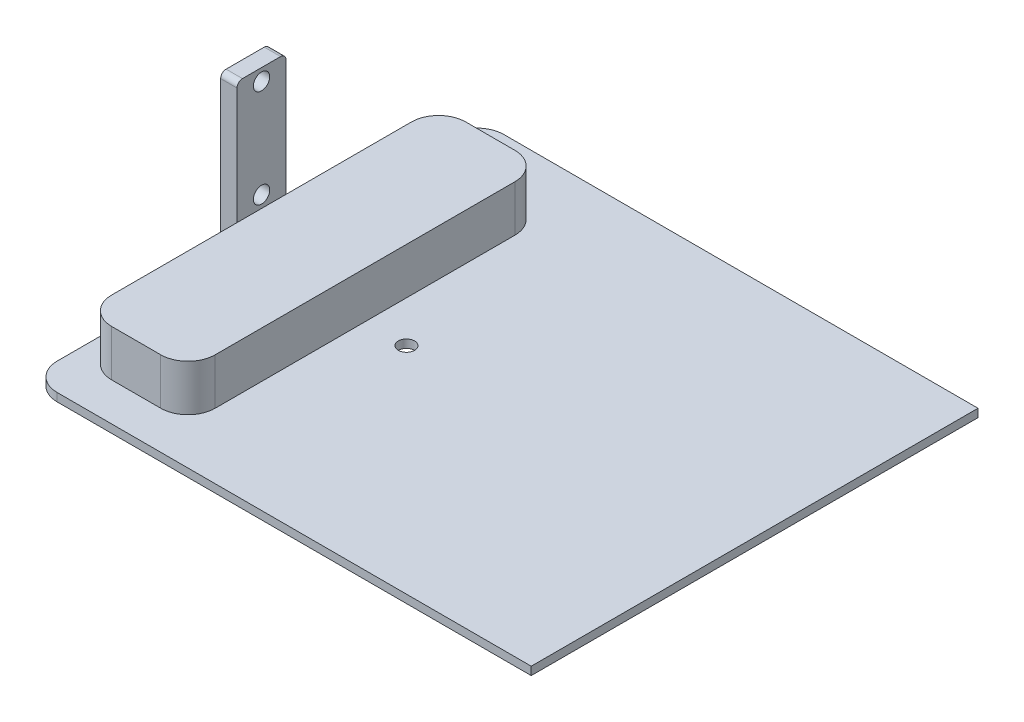
ISO-10303-21;
HEADER;
FILE_DESCRIPTION(('STEP AP214'),'2;1');
FILE_NAME('part.step','',(''),(''),'','','');
FILE_SCHEMA(('AUTOMOTIVE_DESIGN { 1 0 10303 214 1 1 1 1 }'));
ENDSEC;
DATA;
#1=APPLICATION_CONTEXT('core data for automotive mechanical design processes');
#2=APPLICATION_PROTOCOL_DEFINITION('international standard','automotive_design',2000,#1);
#3=PRODUCT_CONTEXT('',#1,'mechanical');
#4=PRODUCT('Part','Part','',(#3));
#5=PRODUCT_RELATED_PRODUCT_CATEGORY('part','',(#4));
#6=PRODUCT_DEFINITION_FORMATION('','',#4);
#7=PRODUCT_DEFINITION_CONTEXT('part definition',#1,'design');
#8=PRODUCT_DEFINITION('design','',#6,#7);
#9=PRODUCT_DEFINITION_SHAPE('','',#8);
#10=(LENGTH_UNIT() NAMED_UNIT(*) SI_UNIT(.MILLI.,.METRE.));
#11=(NAMED_UNIT(*) PLANE_ANGLE_UNIT() SI_UNIT($,.RADIAN.));
#12=(NAMED_UNIT(*) SI_UNIT($,.STERADIAN.) SOLID_ANGLE_UNIT());
#13=UNCERTAINTY_MEASURE_WITH_UNIT(LENGTH_MEASURE(1.E-05),#10,'distance_accuracy_value','');
#14=(GEOMETRIC_REPRESENTATION_CONTEXT(3) GLOBAL_UNCERTAINTY_ASSIGNED_CONTEXT((#13)) GLOBAL_UNIT_ASSIGNED_CONTEXT((#10,
#11,#12)) REPRESENTATION_CONTEXT('',''));
#15=CARTESIAN_POINT('',(0.,0.,0.));
#16=DIRECTION('',(0.,0.,1.));
#17=DIRECTION('',(1.,0.,0.));
#18=AXIS2_PLACEMENT_3D('',#15,#16,#17);
#19=CARTESIAN_POINT('',(0.,1.5,0.));
#20=DIRECTION('',(0.,1.,0.));
#21=DIRECTION('',(0.,0.,1.));
#22=AXIS2_PLACEMENT_3D('',#19,#20,#21);
#23=PLANE('',#22);
#24=CARTESIAN_POINT('',(-16.4,1.5,1.49999999999999));
#25=DIRECTION('',(0.,1.,0.));
#26=DIRECTION('',(0.,0.,1.));
#27=AXIS2_PLACEMENT_3D('',#24,#25,#26);
#28=CIRCLE('',#27,1.5);
#29=CARTESIAN_POINT('',(-16.4,1.5,2.99999999999999));
#30=VERTEX_POINT('',#29);
#31=EDGE_CURVE('E522',#30,#30,#28,.T.);
#32=ORIENTED_EDGE('',*,*,#31,.F.);
#33=EDGE_LOOP('',(#32));
#34=FACE_BOUND('',#33,.T.);
#35=DIRECTION('',(0.,0.,1.));
#36=VECTOR('',#35,1.);
#37=CARTESIAN_POINT('',(-46.,1.5,-41.));
#38=LINE('',#37,#36);
#39=CARTESIAN_POINT('',(-46.,1.5,-36.));
#40=VERTEX_POINT('',#39);
#41=CARTESIAN_POINT('',(-46.,1.5,-8.00000000000001));
#42=VERTEX_POINT('',#41);
#43=EDGE_CURVE('E290',#40,#42,#38,.T.);
#44=ORIENTED_EDGE('',*,*,#43,.T.);
#45=DIRECTION('',(-1.,0.,0.));
#46=VECTOR('',#45,1.);
#47=CARTESIAN_POINT('',(0.,1.5,-8.00000000000005));
#48=LINE('',#47,#46);
#49=CARTESIAN_POINT('',(-43.,1.5,-8.00000000000001));
#50=VERTEX_POINT('',#49);
#51=EDGE_CURVE('E330',#42,#50,#48,.F.);
#52=ORIENTED_EDGE('',*,*,#51,.T.);
#53=DIRECTION('',(0.,0.,1.));
#54=VECTOR('',#53,1.);
#55=CARTESIAN_POINT('',(-43.,1.5,-31.));
#56=LINE('',#55,#54);
#57=CARTESIAN_POINT('',(-43.,1.5,-26.));
#58=VERTEX_POINT('',#57);
#59=EDGE_CURVE('E265',#58,#50,#56,.T.);
#60=ORIENTED_EDGE('',*,*,#59,.F.);
#61=CARTESIAN_POINT('',(-38.,1.5,-26.));
#62=DIRECTION('',(0.,1.,0.));
#63=DIRECTION('',(0.,0.,1.));
#64=AXIS2_PLACEMENT_3D('',#61,#62,#63);
#65=CIRCLE('',#64,5.);
#66=CARTESIAN_POINT('',(-38.,1.5,-31.));
#67=VERTEX_POINT('',#66);
#68=EDGE_CURVE('E416',#58,#67,#65,.F.);
#69=ORIENTED_EDGE('',*,*,#68,.T.);
#70=DIRECTION('',(-1.,0.,0.));
#71=VECTOR('',#70,1.);
#72=CARTESIAN_POINT('',(-43.,1.5,-31.));
#73=LINE('',#72,#71);
#74=CARTESIAN_POINT('',(-29.,1.5,-31.));
#75=VERTEX_POINT('',#74);
#76=EDGE_CURVE('E276',#75,#67,#73,.T.);
#77=ORIENTED_EDGE('',*,*,#76,.F.);
#78=CARTESIAN_POINT('',(-29.,1.5,-26.));
#79=DIRECTION('',(0.,1.,0.));
#80=DIRECTION('',(0.,0.,1.));
#81=AXIS2_PLACEMENT_3D('',#78,#79,#80);
#82=CIRCLE('',#81,5.);
#83=CARTESIAN_POINT('',(-24.,1.5,-26.));
#84=VERTEX_POINT('',#83);
#85=EDGE_CURVE('E413',#75,#84,#82,.F.);
#86=ORIENTED_EDGE('',*,*,#85,.T.);
#87=DIRECTION('',(0.,0.,-1.));
#88=VECTOR('',#87,1.);
#89=CARTESIAN_POINT('',(-24.,1.5,-31.));
#90=LINE('',#89,#88);
#91=CARTESIAN_POINT('',(-24.,1.5,29.));
#92=VERTEX_POINT('',#91);
#93=EDGE_CURVE('E272',#92,#84,#90,.T.);
#94=ORIENTED_EDGE('',*,*,#93,.F.);
#95=CARTESIAN_POINT('',(-29.,1.5,29.));
#96=DIRECTION('',(0.,1.,0.));
#97=DIRECTION('',(0.,0.,1.));
#98=AXIS2_PLACEMENT_3D('',#95,#96,#97);
#99=CIRCLE('',#98,5.);
#100=CARTESIAN_POINT('',(-29.,1.5,34.));
#101=VERTEX_POINT('',#100);
#102=EDGE_CURVE('E407',#92,#101,#99,.F.);
#103=ORIENTED_EDGE('',*,*,#102,.T.);
#104=DIRECTION('',(1.,0.,0.));
#105=VECTOR('',#104,1.);
#106=CARTESIAN_POINT('',(-43.,1.5,34.));
#107=LINE('',#106,#105);
#108=CARTESIAN_POINT('',(-38.,1.5,34.));
#109=VERTEX_POINT('',#108);
#110=EDGE_CURVE('E268',#109,#101,#107,.T.);
#111=ORIENTED_EDGE('',*,*,#110,.F.);
#112=CARTESIAN_POINT('',(-38.,1.5,29.));
#113=DIRECTION('',(0.,1.,0.));
#114=DIRECTION('',(0.,0.,1.));
#115=AXIS2_PLACEMENT_3D('',#112,#113,#114);
#116=CIRCLE('',#115,5.);
#117=CARTESIAN_POINT('',(-43.,1.5,29.));
#118=VERTEX_POINT('',#117);
#119=EDGE_CURVE('E410',#109,#118,#116,.F.);
#120=ORIENTED_EDGE('',*,*,#119,.T.);
#121=CARTESIAN_POINT('',(-43.,1.5,11.));
#122=VERTEX_POINT('',#121);
#123=EDGE_CURVE('E253',#122,#118,#56,.T.);
#124=ORIENTED_EDGE('',*,*,#123,.F.);
#125=DIRECTION('',(1.,0.,0.));
#126=VECTOR('',#125,1.);
#127=CARTESIAN_POINT('',(0.,1.5,11.));
#128=LINE('',#127,#126);
#129=CARTESIAN_POINT('',(-46.,1.5,11.));
#130=VERTEX_POINT('',#129);
#131=EDGE_CURVE('E327',#122,#130,#128,.F.);
#132=ORIENTED_EDGE('',*,*,#131,.T.);
#133=CARTESIAN_POINT('',(-46.,1.5,36.));
#134=VERTEX_POINT('',#133);
#135=EDGE_CURVE('E289',#130,#134,#38,.T.);
#136=ORIENTED_EDGE('',*,*,#135,.T.);
#137=CARTESIAN_POINT('',(-41.,1.5,36.));
#138=DIRECTION('',(0.,1.,0.));
#139=DIRECTION('',(0.,0.,1.));
#140=AXIS2_PLACEMENT_3D('',#137,#138,#139);
#141=CIRCLE('',#140,5.);
#142=CARTESIAN_POINT('',(-41.,1.5,41.));
#143=VERTEX_POINT('',#142);
#144=EDGE_CURVE('E321',#134,#143,#141,.T.);
#145=ORIENTED_EDGE('',*,*,#144,.T.);
#146=DIRECTION('',(1.,0.,0.));
#147=VECTOR('',#146,1.);
#148=CARTESIAN_POINT('',(-46.,1.5,41.));
#149=LINE('',#148,#147);
#150=CARTESIAN_POINT('',(46.,1.5,41.));
#151=VERTEX_POINT('',#150);
#152=EDGE_CURVE('E294',#143,#151,#149,.T.);
#153=ORIENTED_EDGE('',*,*,#152,.T.);
#154=DIRECTION('',(0.,0.,-1.));
#155=VECTOR('',#154,1.);
#156=CARTESIAN_POINT('',(46.,1.5,-41.));
#157=LINE('',#156,#155);
#158=CARTESIAN_POINT('',(46.,1.5,-41.));
#159=VERTEX_POINT('',#158);
#160=EDGE_CURVE('E280',#151,#159,#157,.T.);
#161=ORIENTED_EDGE('',*,*,#160,.T.);
#162=DIRECTION('',(-1.,0.,0.));
#163=VECTOR('',#162,1.);
#164=CARTESIAN_POINT('',(-46.,1.5,-41.));
#165=LINE('',#164,#163);
#166=CARTESIAN_POINT('',(-41.,1.5,-41.));
#167=VERTEX_POINT('',#166);
#168=EDGE_CURVE('E284',#159,#167,#165,.T.);
#169=ORIENTED_EDGE('',*,*,#168,.T.);
#170=CARTESIAN_POINT('',(-41.,1.5,-36.));
#171=DIRECTION('',(0.,1.,0.));
#172=DIRECTION('',(0.,0.,1.));
#173=AXIS2_PLACEMENT_3D('',#170,#171,#172);
#174=CIRCLE('',#173,5.);
#175=EDGE_CURVE('E324',#167,#40,#174,.T.);
#176=ORIENTED_EDGE('',*,*,#175,.T.);
#177=EDGE_LOOP('',(#44,#52,#60,#69,#77,#86,#94,#103,#111,#120,#124,#132,#136,#145,#153,#161,
#169,#176));
#178=FACE_BOUND('',#177,.T.);
#179=ADVANCED_FACE('F45',(#34,#178),#23,.T.);
#180=CARTESIAN_POINT('',(-43.,10.,-31.));
#181=DIRECTION('',(1.,0.,0.));
#182=DIRECTION('',(0.,0.,-1.));
#183=AXIS2_PLACEMENT_3D('',#180,#181,#182);
#184=PLANE('',#183);
#185=DIRECTION('',(0.,-1.,0.));
#186=VECTOR('',#185,1.);
#187=CARTESIAN_POINT('',(-43.,32.4,5.99999999999999));
#188=LINE('',#187,#186);
#189=CARTESIAN_POINT('',(-43.,10.,5.99999999999998));
#190=VERTEX_POINT('',#189);
#191=CARTESIAN_POINT('',(-43.,6.5,5.99999999999999));
#192=VERTEX_POINT('',#191);
#193=EDGE_CURVE('E213',#190,#192,#188,.T.);
#194=ORIENTED_EDGE('',*,*,#193,.T.);
#195=CARTESIAN_POINT('',(-43.,6.5,11.));
#196=DIRECTION('',(1.,0.,0.));
#197=DIRECTION('',(0.,0.,-1.));
#198=AXIS2_PLACEMENT_3D('',#195,#196,#197);
#199=CIRCLE('',#198,5.);
#200=EDGE_CURVE('E345',#192,#122,#199,.F.);
#201=ORIENTED_EDGE('',*,*,#200,.T.);
#202=ORIENTED_EDGE('',*,*,#123,.T.);
#203=DIRECTION('',(0.,-1.,0.));
#204=VECTOR('',#203,1.);
#205=CARTESIAN_POINT('',(-43.,10.,29.));
#206=LINE('',#205,#204);
#207=CARTESIAN_POINT('',(-43.,10.,29.));
#208=VERTEX_POINT('',#207);
#209=EDGE_CURVE('E342',#118,#208,#206,.F.);
#210=ORIENTED_EDGE('',*,*,#209,.T.);
#211=DIRECTION('',(0.,0.,1.));
#212=VECTOR('',#211,1.);
#213=CARTESIAN_POINT('',(-43.,10.,-31.));
#214=LINE('',#213,#212);
#215=EDGE_CURVE('E232',#190,#208,#214,.T.);
#216=ORIENTED_EDGE('',*,*,#215,.F.);
#217=EDGE_LOOP('',(#194,#201,#202,#210,#216));
#218=FACE_BOUND('',#217,.T.);
#219=ADVANCED_FACE('F457',(#218),#184,.F.);
#220=ORIENTED_EDGE('',*,*,#59,.T.);
#221=CARTESIAN_POINT('',(-43.,6.5,-8.00000000000001));
#222=DIRECTION('',(1.,0.,0.));
#223=DIRECTION('',(0.,0.,-1.));
#224=AXIS2_PLACEMENT_3D('',#221,#222,#223);
#225=CIRCLE('',#224,5.);
#226=CARTESIAN_POINT('',(-43.,6.5,-3.00000000000001));
#227=VERTEX_POINT('',#226);
#228=EDGE_CURVE('E241',#50,#227,#225,.F.);
#229=ORIENTED_EDGE('',*,*,#228,.T.);
#230=DIRECTION('',(0.,-1.,0.));
#231=VECTOR('',#230,1.);
#232=CARTESIAN_POINT('',(-43.,32.4,-3.00000000000001));
#233=LINE('',#232,#231);
#234=CARTESIAN_POINT('',(-43.,10.,-3.00000000000001));
#235=VERTEX_POINT('',#234);
#236=EDGE_CURVE('E206',#235,#227,#233,.T.);
#237=ORIENTED_EDGE('',*,*,#236,.F.);
#238=CARTESIAN_POINT('',(-43.,10.,-26.));
#239=VERTEX_POINT('',#238);
#240=EDGE_CURVE('E218',#239,#235,#214,.T.);
#241=ORIENTED_EDGE('',*,*,#240,.F.);
#242=DIRECTION('',(0.,-1.,0.));
#243=VECTOR('',#242,1.);
#244=CARTESIAN_POINT('',(-43.,10.,-26.));
#245=LINE('',#244,#243);
#246=EDGE_CURVE('E333',#239,#58,#245,.T.);
#247=ORIENTED_EDGE('',*,*,#246,.T.);
#248=EDGE_LOOP('',(#220,#229,#237,#241,#247));
#249=FACE_BOUND('',#248,.T.);
#250=ADVANCED_FACE('F239',(#249),#184,.F.);
#251=CARTESIAN_POINT('',(46.,1.5,-41.));
#252=DIRECTION('',(-1.,0.,0.));
#253=DIRECTION('',(0.,0.,1.));
#254=AXIS2_PLACEMENT_3D('',#251,#252,#253);
#255=PLANE('',#254);
#256=DIRECTION('',(0.,0.,-1.));
#257=VECTOR('',#256,1.);
#258=CARTESIAN_POINT('',(46.,0.,-41.));
#259=LINE('',#258,#257);
#260=CARTESIAN_POINT('',(46.,0.,41.));
#261=VERTEX_POINT('',#260);
#262=CARTESIAN_POINT('',(46.,0.,-41.));
#263=VERTEX_POINT('',#262);
#264=EDGE_CURVE('E264',#261,#263,#259,.T.);
#265=ORIENTED_EDGE('',*,*,#264,.T.);
#266=DIRECTION('',(0.,-1.,0.));
#267=VECTOR('',#266,1.);
#268=CARTESIAN_POINT('',(46.,1.5,-41.));
#269=LINE('',#268,#267);
#270=EDGE_CURVE('E314',#159,#263,#269,.T.);
#271=ORIENTED_EDGE('',*,*,#270,.F.);
#272=ORIENTED_EDGE('',*,*,#160,.F.);
#273=DIRECTION('',(0.,-1.,0.));
#274=VECTOR('',#273,1.);
#275=CARTESIAN_POINT('',(46.,1.5,41.));
#276=LINE('',#275,#274);
#277=EDGE_CURVE('E297',#151,#261,#276,.T.);
#278=ORIENTED_EDGE('',*,*,#277,.T.);
#279=EDGE_LOOP('',(#265,#271,#272,#278));
#280=FACE_BOUND('',#279,.T.);
#281=ADVANCED_FACE('F552',(#280),#255,.F.);
#282=CARTESIAN_POINT('',(-46.,1.5,-41.));
#283=DIRECTION('',(0.,0.,1.));
#284=DIRECTION('',(1.,0.,0.));
#285=AXIS2_PLACEMENT_3D('',#282,#283,#284);
#286=PLANE('',#285);
#287=DIRECTION('',(-1.,0.,0.));
#288=VECTOR('',#287,1.);
#289=CARTESIAN_POINT('',(-46.,0.,-41.));
#290=LINE('',#289,#288);
#291=CARTESIAN_POINT('',(-41.,0.,-41.));
#292=VERTEX_POINT('',#291);
#293=EDGE_CURVE('E301',#263,#292,#290,.T.);
#294=ORIENTED_EDGE('',*,*,#293,.T.);
#295=DIRECTION('',(0.,-1.,0.));
#296=VECTOR('',#295,1.);
#297=CARTESIAN_POINT('',(-41.,1.5,-41.));
#298=LINE('',#297,#296);
#299=EDGE_CURVE('E393',#292,#167,#298,.F.);
#300=ORIENTED_EDGE('',*,*,#299,.T.);
#301=ORIENTED_EDGE('',*,*,#168,.F.);
#302=ORIENTED_EDGE('',*,*,#270,.T.);
#303=EDGE_LOOP('',(#294,#300,#301,#302));
#304=FACE_BOUND('',#303,.T.);
#305=ADVANCED_FACE('F548',(#304),#286,.F.);
#306=CARTESIAN_POINT('',(-46.,1.5,-41.));
#307=DIRECTION('',(1.,0.,0.));
#308=DIRECTION('',(0.,0.,-1.));
#309=AXIS2_PLACEMENT_3D('',#306,#307,#308);
#310=PLANE('',#309);
#311=CARTESIAN_POINT('',(-46.,30.2,1.49999999999999));
#312=DIRECTION('',(1.,0.,0.));
#313=DIRECTION('',(0.,0.,-1.));
#314=AXIS2_PLACEMENT_3D('',#311,#312,#313);
#315=CIRCLE('',#314,1.5);
#316=CARTESIAN_POINT('',(-46.,30.2,0.));
#317=VERTEX_POINT('',#316);
#318=EDGE_CURVE('E507',#317,#317,#315,.T.);
#319=ORIENTED_EDGE('',*,*,#318,.T.);
#320=EDGE_LOOP('',(#319));
#321=FACE_BOUND('',#320,.T.);
#322=CARTESIAN_POINT('',(-46.,12.2,1.49999999999999));
#323=DIRECTION('',(1.,0.,0.));
#324=DIRECTION('',(0.,0.,1.));
#325=AXIS2_PLACEMENT_3D('',#322,#323,#324);
#326=CIRCLE('',#325,1.5);
#327=CARTESIAN_POINT('',(-46.,12.2,2.99999999999999));
#328=VERTEX_POINT('',#327);
#329=EDGE_CURVE('E503',#328,#328,#326,.T.);
#330=ORIENTED_EDGE('',*,*,#329,.T.);
#331=EDGE_LOOP('',(#330));
#332=FACE_BOUND('',#331,.T.);
#333=DIRECTION('',(0.,-1.,0.));
#334=VECTOR('',#333,1.);
#335=CARTESIAN_POINT('',(-46.,32.4,5.99999999999998));
#336=LINE('',#335,#334);
#337=CARTESIAN_POINT('',(-46.,31.4,5.99999999999998));
#338=VERTEX_POINT('',#337);
#339=CARTESIAN_POINT('',(-46.,6.5,5.99999999999998));
#340=VERTEX_POINT('',#339);
#341=EDGE_CURVE('E251',#338,#340,#336,.T.);
#342=ORIENTED_EDGE('',*,*,#341,.F.);
#343=CARTESIAN_POINT('',(-46.,31.4,4.99999999999998));
#344=DIRECTION('',(1.,0.,0.));
#345=DIRECTION('',(0.,0.,-1.));
#346=AXIS2_PLACEMENT_3D('',#343,#344,#345);
#347=CIRCLE('',#346,1.);
#348=CARTESIAN_POINT('',(-46.,32.4,4.99999999999998));
#349=VERTEX_POINT('',#348);
#350=EDGE_CURVE('E54',#338,#349,#347,.F.);
#351=ORIENTED_EDGE('',*,*,#350,.T.);
#352=DIRECTION('',(0.,0.,1.));
#353=VECTOR('',#352,1.);
#354=CARTESIAN_POINT('',(-46.,32.4,5.99999999999998));
#355=LINE('',#354,#353);
#356=CARTESIAN_POINT('',(-46.,32.4,-2.00000000000001));
#357=VERTEX_POINT('',#356);
#358=EDGE_CURVE('E440',#357,#349,#355,.T.);
#359=ORIENTED_EDGE('',*,*,#358,.F.);
#360=CARTESIAN_POINT('',(-46.,31.4,-2.00000000000001));
#361=DIRECTION('',(1.,0.,0.));
#362=DIRECTION('',(0.,0.,-1.));
#363=AXIS2_PLACEMENT_3D('',#360,#361,#362);
#364=CIRCLE('',#363,1.);
#365=CARTESIAN_POINT('',(-46.,31.4,-3.00000000000001));
#366=VERTEX_POINT('',#365);
#367=EDGE_CURVE('E61',#357,#366,#364,.F.);
#368=ORIENTED_EDGE('',*,*,#367,.T.);
#369=DIRECTION('',(0.,-1.,0.));
#370=VECTOR('',#369,1.);
#371=CARTESIAN_POINT('',(-46.,32.4,-3.00000000000001));
#372=LINE('',#371,#370);
#373=CARTESIAN_POINT('',(-46.,6.5,-3.00000000000001));
#374=VERTEX_POINT('',#373);
#375=EDGE_CURVE('E243',#366,#374,#372,.T.);
#376=ORIENTED_EDGE('',*,*,#375,.T.);
#377=CARTESIAN_POINT('',(-46.,6.5,-8.00000000000001));
#378=DIRECTION('',(1.,0.,0.));
#379=DIRECTION('',(0.,0.,-1.));
#380=AXIS2_PLACEMENT_3D('',#377,#378,#379);
#381=CIRCLE('',#380,5.);
#382=EDGE_CURVE('E400',#374,#42,#381,.T.);
#383=ORIENTED_EDGE('',*,*,#382,.T.);
#384=ORIENTED_EDGE('',*,*,#43,.F.);
#385=DIRECTION('',(0.,-1.,0.));
#386=VECTOR('',#385,1.);
#387=CARTESIAN_POINT('',(-46.,1.5,-36.));
#388=LINE('',#387,#386);
#389=CARTESIAN_POINT('',(-46.,0.,-36.));
#390=VERTEX_POINT('',#389);
#391=EDGE_CURVE('E383',#40,#390,#388,.T.);
#392=ORIENTED_EDGE('',*,*,#391,.T.);
#393=DIRECTION('',(0.,0.,1.));
#394=VECTOR('',#393,1.);
#395=CARTESIAN_POINT('',(-46.,0.,-41.));
#396=LINE('',#395,#394);
#397=CARTESIAN_POINT('',(-46.,0.,36.));
#398=VERTEX_POINT('',#397);
#399=EDGE_CURVE('E305',#390,#398,#396,.T.);
#400=ORIENTED_EDGE('',*,*,#399,.T.);
#401=DIRECTION('',(0.,-1.,0.));
#402=VECTOR('',#401,1.);
#403=CARTESIAN_POINT('',(-46.,1.5,36.));
#404=LINE('',#403,#402);
#405=EDGE_CURVE('E380',#398,#134,#404,.F.);
#406=ORIENTED_EDGE('',*,*,#405,.T.);
#407=ORIENTED_EDGE('',*,*,#135,.F.);
#408=CARTESIAN_POINT('',(-46.,6.5,11.));
#409=DIRECTION('',(1.,0.,0.));
#410=DIRECTION('',(0.,0.,-1.));
#411=AXIS2_PLACEMENT_3D('',#408,#409,#410);
#412=CIRCLE('',#411,5.);
#413=EDGE_CURVE('E403',#130,#340,#412,.T.);
#414=ORIENTED_EDGE('',*,*,#413,.T.);
#415=EDGE_LOOP('',(#342,#351,#359,#368,#376,#383,#384,#392,#400,#406,#407,#414));
#416=FACE_BOUND('',#415,.T.);
#417=ADVANCED_FACE('F439',(#321,#332,#416),#310,.F.);
#418=CARTESIAN_POINT('',(-46.,1.5,41.));
#419=DIRECTION('',(0.,0.,-1.));
#420=DIRECTION('',(-1.,0.,0.));
#421=AXIS2_PLACEMENT_3D('',#418,#419,#420);
#422=PLANE('',#421);
#423=ORIENTED_EDGE('',*,*,#152,.F.);
#424=DIRECTION('',(0.,-1.,0.));
#425=VECTOR('',#424,1.);
#426=CARTESIAN_POINT('',(-41.,1.5,41.));
#427=LINE('',#426,#425);
#428=CARTESIAN_POINT('',(-41.,0.,41.));
#429=VERTEX_POINT('',#428);
#430=EDGE_CURVE('E396',#143,#429,#427,.T.);
#431=ORIENTED_EDGE('',*,*,#430,.T.);
#432=DIRECTION('',(1.,0.,0.));
#433=VECTOR('',#432,1.);
#434=CARTESIAN_POINT('',(-46.,0.,41.));
#435=LINE('',#434,#433);
#436=EDGE_CURVE('E285',#429,#261,#435,.T.);
#437=ORIENTED_EDGE('',*,*,#436,.T.);
#438=ORIENTED_EDGE('',*,*,#277,.F.);
#439=EDGE_LOOP('',(#423,#431,#437,#438));
#440=FACE_BOUND('',#439,.T.);
#441=ADVANCED_FACE('F541',(#440),#422,.F.);
#442=CARTESIAN_POINT('',(0.,0.,0.));
#443=DIRECTION('',(0.,1.,0.));
#444=DIRECTION('',(0.,0.,1.));
#445=AXIS2_PLACEMENT_3D('',#442,#443,#444);
#446=PLANE('',#445);
#447=CARTESIAN_POINT('',(-16.4,0.,1.49999999999999));
#448=DIRECTION('',(0.,1.,0.));
#449=DIRECTION('',(0.,0.,1.));
#450=AXIS2_PLACEMENT_3D('',#447,#448,#449);
#451=CIRCLE('',#450,1.5);
#452=CARTESIAN_POINT('',(-16.4,0.,2.99999999999999));
#453=VERTEX_POINT('',#452);
#454=EDGE_CURVE('E512',#453,#453,#451,.F.);
#455=ORIENTED_EDGE('',*,*,#454,.F.);
#456=EDGE_LOOP('',(#455));
#457=FACE_BOUND('',#456,.T.);
#458=ORIENTED_EDGE('',*,*,#399,.F.);
#459=CARTESIAN_POINT('',(-41.,0.,-36.));
#460=DIRECTION('',(0.,1.,0.));
#461=DIRECTION('',(0.,0.,1.));
#462=AXIS2_PLACEMENT_3D('',#459,#460,#461);
#463=CIRCLE('',#462,5.);
#464=EDGE_CURVE('E390',#390,#292,#463,.F.);
#465=ORIENTED_EDGE('',*,*,#464,.T.);
#466=ORIENTED_EDGE('',*,*,#293,.F.);
#467=ORIENTED_EDGE('',*,*,#264,.F.);
#468=ORIENTED_EDGE('',*,*,#436,.F.);
#469=CARTESIAN_POINT('',(-41.,0.,36.));
#470=DIRECTION('',(0.,1.,0.));
#471=DIRECTION('',(0.,0.,1.));
#472=AXIS2_PLACEMENT_3D('',#469,#470,#471);
#473=CIRCLE('',#472,5.);
#474=EDGE_CURVE('E387',#429,#398,#473,.F.);
#475=ORIENTED_EDGE('',*,*,#474,.T.);
#476=EDGE_LOOP('',(#458,#465,#466,#467,#468,#475));
#477=FACE_BOUND('',#476,.T.);
#478=ADVANCED_FACE('F538',(#457,#477),#446,.F.);
#479=CARTESIAN_POINT('',(-43.,10.,34.));
#480=DIRECTION('',(0.,0.,-1.));
#481=DIRECTION('',(-1.,0.,0.));
#482=AXIS2_PLACEMENT_3D('',#479,#480,#481);
#483=PLANE('',#482);
#484=ORIENTED_EDGE('',*,*,#110,.T.);
#485=DIRECTION('',(0.,-1.,0.));
#486=VECTOR('',#485,1.);
#487=CARTESIAN_POINT('',(-29.,10.,34.));
#488=LINE('',#487,#486);
#489=CARTESIAN_POINT('',(-29.,10.,34.));
#490=VERTEX_POINT('',#489);
#491=EDGE_CURVE('E359',#101,#490,#488,.F.);
#492=ORIENTED_EDGE('',*,*,#491,.T.);
#493=DIRECTION('',(1.,0.,0.));
#494=VECTOR('',#493,1.);
#495=CARTESIAN_POINT('',(-43.,10.,34.));
#496=LINE('',#495,#494);
#497=CARTESIAN_POINT('',(-38.,10.,34.));
#498=VERTEX_POINT('',#497);
#499=EDGE_CURVE('E230',#498,#490,#496,.T.);
#500=ORIENTED_EDGE('',*,*,#499,.F.);
#501=DIRECTION('',(0.,-1.,0.));
#502=VECTOR('',#501,1.);
#503=CARTESIAN_POINT('',(-38.,10.,34.));
#504=LINE('',#503,#502);
#505=EDGE_CURVE('E355',#498,#109,#504,.T.);
#506=ORIENTED_EDGE('',*,*,#505,.T.);
#507=EDGE_LOOP('',(#484,#492,#500,#506));
#508=FACE_BOUND('',#507,.T.);
#509=ADVANCED_FACE('F472',(#508),#483,.F.);
#510=CARTESIAN_POINT('',(-24.,10.,-31.));
#511=DIRECTION('',(-1.,0.,0.));
#512=DIRECTION('',(0.,0.,1.));
#513=AXIS2_PLACEMENT_3D('',#510,#511,#512);
#514=PLANE('',#513);
#515=DIRECTION('',(0.,0.,-1.));
#516=VECTOR('',#515,1.);
#517=CARTESIAN_POINT('',(-24.,10.,-31.));
#518=LINE('',#517,#516);
#519=CARTESIAN_POINT('',(-24.,10.,29.));
#520=VERTEX_POINT('',#519);
#521=CARTESIAN_POINT('',(-24.,10.,-26.));
#522=VERTEX_POINT('',#521);
#523=EDGE_CURVE('E257',#520,#522,#518,.T.);
#524=ORIENTED_EDGE('',*,*,#523,.F.);
#525=DIRECTION('',(0.,-1.,0.));
#526=VECTOR('',#525,1.);
#527=CARTESIAN_POINT('',(-24.,10.,29.));
#528=LINE('',#527,#526);
#529=EDGE_CURVE('E351',#520,#92,#528,.T.);
#530=ORIENTED_EDGE('',*,*,#529,.T.);
#531=ORIENTED_EDGE('',*,*,#93,.T.);
#532=DIRECTION('',(0.,-1.,0.));
#533=VECTOR('',#532,1.);
#534=CARTESIAN_POINT('',(-24.,10.,-26.));
#535=LINE('',#534,#533);
#536=EDGE_CURVE('E348',#84,#522,#535,.F.);
#537=ORIENTED_EDGE('',*,*,#536,.T.);
#538=EDGE_LOOP('',(#524,#530,#531,#537));
#539=FACE_BOUND('',#538,.T.);
#540=ADVANCED_FACE('F481',(#539),#514,.F.);
#541=CARTESIAN_POINT('',(-43.,10.,-31.));
#542=DIRECTION('',(0.,0.,1.));
#543=DIRECTION('',(1.,0.,0.));
#544=AXIS2_PLACEMENT_3D('',#541,#542,#543);
#545=PLANE('',#544);
#546=DIRECTION('',(-1.,0.,0.));
#547=VECTOR('',#546,1.);
#548=CARTESIAN_POINT('',(-43.,10.,-31.));
#549=LINE('',#548,#547);
#550=CARTESIAN_POINT('',(-29.,10.,-31.));
#551=VERTEX_POINT('',#550);
#552=CARTESIAN_POINT('',(-38.,10.,-31.));
#553=VERTEX_POINT('',#552);
#554=EDGE_CURVE('E261',#551,#553,#549,.T.);
#555=ORIENTED_EDGE('',*,*,#554,.F.);
#556=DIRECTION('',(0.,-1.,0.));
#557=VECTOR('',#556,1.);
#558=CARTESIAN_POINT('',(-29.,10.,-31.));
#559=LINE('',#558,#557);
#560=EDGE_CURVE('E376',#551,#75,#559,.T.);
#561=ORIENTED_EDGE('',*,*,#560,.T.);
#562=ORIENTED_EDGE('',*,*,#76,.T.);
#563=DIRECTION('',(0.,-1.,0.));
#564=VECTOR('',#563,1.);
#565=CARTESIAN_POINT('',(-38.,10.,-31.));
#566=LINE('',#565,#564);
#567=EDGE_CURVE('E373',#67,#553,#566,.F.);
#568=ORIENTED_EDGE('',*,*,#567,.T.);
#569=EDGE_LOOP('',(#555,#561,#562,#568));
#570=FACE_BOUND('',#569,.T.);
#571=ADVANCED_FACE('F489',(#570),#545,.F.);
#572=CARTESIAN_POINT('',(0.,10.,0.));
#573=DIRECTION('',(0.,1.,0.));
#574=DIRECTION('',(0.,0.,1.));
#575=AXIS2_PLACEMENT_3D('',#572,#573,#574);
#576=PLANE('',#575);
#577=ORIENTED_EDGE('',*,*,#499,.T.);
#578=CARTESIAN_POINT('',(-29.,10.,29.));
#579=DIRECTION('',(0.,1.,0.));
#580=DIRECTION('',(0.,0.,1.));
#581=AXIS2_PLACEMENT_3D('',#578,#579,#580);
#582=CIRCLE('',#581,5.);
#583=EDGE_CURVE('E370',#490,#520,#582,.T.);
#584=ORIENTED_EDGE('',*,*,#583,.T.);
#585=ORIENTED_EDGE('',*,*,#523,.T.);
#586=CARTESIAN_POINT('',(-29.,10.,-26.));
#587=DIRECTION('',(0.,1.,0.));
#588=DIRECTION('',(0.,0.,1.));
#589=AXIS2_PLACEMENT_3D('',#586,#587,#588);
#590=CIRCLE('',#589,5.);
#591=EDGE_CURVE('E364',#522,#551,#590,.T.);
#592=ORIENTED_EDGE('',*,*,#591,.T.);
#593=ORIENTED_EDGE('',*,*,#554,.T.);
#594=CARTESIAN_POINT('',(-38.,10.,-26.));
#595=DIRECTION('',(0.,1.,0.));
#596=DIRECTION('',(0.,0.,1.));
#597=AXIS2_PLACEMENT_3D('',#594,#595,#596);
#598=CIRCLE('',#597,5.);
#599=EDGE_CURVE('E225',#553,#239,#598,.T.);
#600=ORIENTED_EDGE('',*,*,#599,.T.);
#601=ORIENTED_EDGE('',*,*,#240,.T.);
#602=EDGE_CURVE('E222',#235,#190,#214,.T.);
#603=ORIENTED_EDGE('',*,*,#602,.T.);
#604=ORIENTED_EDGE('',*,*,#215,.T.);
#605=CARTESIAN_POINT('',(-38.,10.,29.));
#606=DIRECTION('',(0.,1.,0.));
#607=DIRECTION('',(0.,0.,1.));
#608=AXIS2_PLACEMENT_3D('',#605,#606,#607);
#609=CIRCLE('',#608,5.);
#610=EDGE_CURVE('E367',#208,#498,#609,.T.);
#611=ORIENTED_EDGE('',*,*,#610,.T.);
#612=EDGE_LOOP('',(#577,#584,#585,#592,#593,#600,#601,#603,#604,#611));
#613=FACE_BOUND('',#612,.T.);
#614=ADVANCED_FACE('F220',(#613),#576,.T.);
#615=CARTESIAN_POINT('',(-46.,32.4,5.99999999999998));
#616=DIRECTION('',(0.,0.,-1.));
#617=DIRECTION('',(-1.,0.,0.));
#618=AXIS2_PLACEMENT_3D('',#615,#616,#617);
#619=PLANE('',#618);
#620=CARTESIAN_POINT('',(-43.,31.4,5.99999999999999));
#621=VERTEX_POINT('',#620);
#622=EDGE_CURVE('E235',#621,#190,#188,.T.);
#623=ORIENTED_EDGE('',*,*,#622,.F.);
#624=DIRECTION('',(1.,0.,0.));
#625=VECTOR('',#624,1.);
#626=CARTESIAN_POINT('',(-46.,31.4,5.99999999999998));
#627=LINE('',#626,#625);
#628=EDGE_CURVE('E69',#621,#338,#627,.F.);
#629=ORIENTED_EDGE('',*,*,#628,.T.);
#630=ORIENTED_EDGE('',*,*,#341,.T.);
#631=DIRECTION('',(1.,0.,0.));
#632=VECTOR('',#631,1.);
#633=CARTESIAN_POINT('',(-46.,6.5,5.99999999999998));
#634=LINE('',#633,#632);
#635=EDGE_CURVE('E338',#340,#192,#634,.T.);
#636=ORIENTED_EDGE('',*,*,#635,.T.);
#637=ORIENTED_EDGE('',*,*,#193,.F.);
#638=EDGE_LOOP('',(#623,#629,#630,#636,#637));
#639=FACE_BOUND('',#638,.T.);
#640=ADVANCED_FACE('F451',(#639),#619,.F.);
#641=CARTESIAN_POINT('',(-43.,32.4,5.99999999999999));
#642=DIRECTION('',(-1.,0.,0.));
#643=DIRECTION('',(0.,0.,1.));
#644=AXIS2_PLACEMENT_3D('',#641,#642,#643);
#645=PLANE('',#644);
#646=CARTESIAN_POINT('',(-43.,30.2,1.49999999999999));
#647=DIRECTION('',(-1.,0.,0.));
#648=DIRECTION('',(0.,0.,1.));
#649=AXIS2_PLACEMENT_3D('',#646,#647,#648);
#650=CIRCLE('',#649,1.5);
#651=CARTESIAN_POINT('',(-43.,30.2,2.99999999999999));
#652=VERTEX_POINT('',#651);
#653=EDGE_CURVE('E448',#652,#652,#650,.T.);
#654=ORIENTED_EDGE('',*,*,#653,.T.);
#655=EDGE_LOOP('',(#654));
#656=FACE_BOUND('',#655,.T.);
#657=CARTESIAN_POINT('',(-43.,12.2,1.49999999999999));
#658=DIRECTION('',(-1.,0.,0.));
#659=DIRECTION('',(0.,0.,1.));
#660=AXIS2_PLACEMENT_3D('',#657,#658,#659);
#661=CIRCLE('',#660,1.5);
#662=CARTESIAN_POINT('',(-43.,12.2,2.99999999999999));
#663=VERTEX_POINT('',#662);
#664=EDGE_CURVE('E508',#663,#663,#661,.T.);
#665=ORIENTED_EDGE('',*,*,#664,.T.);
#666=EDGE_LOOP('',(#665));
#667=FACE_BOUND('',#666,.T.);
#668=DIRECTION('',(0.,0.,-1.));
#669=VECTOR('',#668,1.);
#670=CARTESIAN_POINT('',(-43.,32.4,5.99999999999999));
#671=LINE('',#670,#669);
#672=CARTESIAN_POINT('',(-43.,32.4,4.99999999999999));
#673=VERTEX_POINT('',#672);
#674=CARTESIAN_POINT('',(-43.,32.4,-2.00000000000001));
#675=VERTEX_POINT('',#674);
#676=EDGE_CURVE('E245',#673,#675,#671,.T.);
#677=ORIENTED_EDGE('',*,*,#676,.F.);
#678=CARTESIAN_POINT('',(-43.,31.4,4.99999999999999));
#679=DIRECTION('',(-1.,0.,0.));
#680=DIRECTION('',(0.,0.,1.));
#681=AXIS2_PLACEMENT_3D('',#678,#679,#680);
#682=CIRCLE('',#681,1.);
#683=EDGE_CURVE('E430',#673,#621,#682,.F.);
#684=ORIENTED_EDGE('',*,*,#683,.T.);
#685=ORIENTED_EDGE('',*,*,#622,.T.);
#686=ORIENTED_EDGE('',*,*,#602,.F.);
#687=CARTESIAN_POINT('',(-43.,31.4,-3.00000000000001));
#688=VERTEX_POINT('',#687);
#689=EDGE_CURVE('E201',#688,#235,#233,.T.);
#690=ORIENTED_EDGE('',*,*,#689,.F.);
#691=CARTESIAN_POINT('',(-43.,31.4,-2.00000000000001));
#692=DIRECTION('',(-1.,0.,0.));
#693=DIRECTION('',(0.,0.,1.));
#694=AXIS2_PLACEMENT_3D('',#691,#692,#693);
#695=CIRCLE('',#694,1.);
#696=EDGE_CURVE('E427',#688,#675,#695,.F.);
#697=ORIENTED_EDGE('',*,*,#696,.T.);
#698=EDGE_LOOP('',(#677,#684,#685,#686,#690,#697));
#699=FACE_BOUND('',#698,.T.);
#700=ADVANCED_FACE('F234',(#656,#667,#699),#645,.F.);
#701=CARTESIAN_POINT('',(-46.,32.4,-3.00000000000001));
#702=DIRECTION('',(0.,0.,1.));
#703=DIRECTION('',(1.,0.,0.));
#704=AXIS2_PLACEMENT_3D('',#701,#702,#703);
#705=PLANE('',#704);
#706=ORIENTED_EDGE('',*,*,#375,.F.);
#707=DIRECTION('',(-1.,0.,0.));
#708=VECTOR('',#707,1.);
#709=CARTESIAN_POINT('',(-46.,31.4,-3.00000000000001));
#710=LINE('',#709,#708);
#711=EDGE_CURVE('E11',#366,#688,#710,.F.);
#712=ORIENTED_EDGE('',*,*,#711,.T.);
#713=ORIENTED_EDGE('',*,*,#689,.T.);
#714=ORIENTED_EDGE('',*,*,#236,.T.);
#715=DIRECTION('',(-1.,0.,0.));
#716=VECTOR('',#715,1.);
#717=CARTESIAN_POINT('',(-46.,6.5,-3.00000000000001));
#718=LINE('',#717,#716);
#719=EDGE_CURVE('E318',#227,#374,#718,.T.);
#720=ORIENTED_EDGE('',*,*,#719,.T.);
#721=EDGE_LOOP('',(#706,#712,#713,#714,#720));
#722=FACE_BOUND('',#721,.T.);
#723=ADVANCED_FACE('F203',(#722),#705,.F.);
#724=CARTESIAN_POINT('',(0.,32.4,0.));
#725=DIRECTION('',(0.,-1.,0.));
#726=DIRECTION('',(0.,0.,-1.));
#727=AXIS2_PLACEMENT_3D('',#724,#725,#726);
#728=PLANE('',#727);
#729=ORIENTED_EDGE('',*,*,#358,.T.);
#730=DIRECTION('',(1.,0.,0.));
#731=VECTOR('',#730,1.);
#732=CARTESIAN_POINT('',(0.,32.4,5.00000000000002));
#733=LINE('',#732,#731);
#734=EDGE_CURVE('E423',#349,#673,#733,.T.);
#735=ORIENTED_EDGE('',*,*,#734,.T.);
#736=ORIENTED_EDGE('',*,*,#676,.T.);
#737=DIRECTION('',(-1.,0.,0.));
#738=VECTOR('',#737,1.);
#739=CARTESIAN_POINT('',(0.,32.4,-2.00000000000005));
#740=LINE('',#739,#738);
#741=EDGE_CURVE('E419',#675,#357,#740,.T.);
#742=ORIENTED_EDGE('',*,*,#741,.T.);
#743=EDGE_LOOP('',(#729,#735,#736,#742));
#744=FACE_BOUND('',#743,.T.);
#745=ADVANCED_FACE('F444',(#744),#728,.F.);
#746=CARTESIAN_POINT('',(-38.7573593128807,12.2,1.49999999999999));
#747=DIRECTION('',(-1.,0.,0.));
#748=DIRECTION('',(0.,0.,1.));
#749=AXIS2_PLACEMENT_3D('',#746,#747,#748);
#750=CYLINDRICAL_SURFACE('',#749,1.5);
#751=ORIENTED_EDGE('',*,*,#664,.F.);
#752=EDGE_LOOP('',(#751));
#753=FACE_BOUND('',#752,.T.);
#754=ORIENTED_EDGE('',*,*,#329,.F.);
#755=EDGE_LOOP('',(#754));
#756=FACE_BOUND('',#755,.T.);
#757=ADVANCED_FACE('F657',(#753,#756),#750,.F.);
#758=CARTESIAN_POINT('',(-38.7573593128807,30.2,1.49999999999999));
#759=DIRECTION('',(-1.,0.,0.));
#760=DIRECTION('',(0.,0.,1.));
#761=AXIS2_PLACEMENT_3D('',#758,#759,#760);
#762=CYLINDRICAL_SURFACE('',#761,1.5);
#763=ORIENTED_EDGE('',*,*,#653,.F.);
#764=EDGE_LOOP('',(#763));
#765=FACE_BOUND('',#764,.T.);
#766=ORIENTED_EDGE('',*,*,#318,.F.);
#767=EDGE_LOOP('',(#766));
#768=FACE_BOUND('',#767,.T.);
#769=ADVANCED_FACE('F647',(#765,#768),#762,.F.);
#770=CARTESIAN_POINT('',(-16.4,-4.24264068711928,1.49999999999999));
#771=DIRECTION('',(0.,1.,0.));
#772=DIRECTION('',(0.,0.,1.));
#773=AXIS2_PLACEMENT_3D('',#770,#771,#772);
#774=CYLINDRICAL_SURFACE('',#773,1.5);
#775=ORIENTED_EDGE('',*,*,#454,.T.);
#776=EDGE_LOOP('',(#775));
#777=FACE_BOUND('',#776,.T.);
#778=ORIENTED_EDGE('',*,*,#31,.T.);
#779=EDGE_LOOP('',(#778));
#780=FACE_BOUND('',#779,.T.);
#781=ADVANCED_FACE('F527',(#777,#780),#774,.F.);
#782=CARTESIAN_POINT('',(-46.,6.5,-8.00000000000001));
#783=DIRECTION('',(-1.,0.,0.));
#784=DIRECTION('',(0.,0.,1.));
#785=AXIS2_PLACEMENT_3D('',#782,#783,#784);
#786=CYLINDRICAL_SURFACE('',#785,5.);
#787=ORIENTED_EDGE('',*,*,#228,.F.);
#788=ORIENTED_EDGE('',*,*,#51,.F.);
#789=ORIENTED_EDGE('',*,*,#382,.F.);
#790=ORIENTED_EDGE('',*,*,#719,.F.);
#791=EDGE_LOOP('',(#787,#788,#789,#790));
#792=FACE_BOUND('',#791,.T.);
#793=ADVANCED_FACE('F499',(#792),#786,.F.);
#794=CARTESIAN_POINT('',(-46.,6.5,11.));
#795=DIRECTION('',(1.,0.,0.));
#796=DIRECTION('',(0.,0.,-1.));
#797=AXIS2_PLACEMENT_3D('',#794,#795,#796);
#798=CYLINDRICAL_SURFACE('',#797,5.);
#799=ORIENTED_EDGE('',*,*,#413,.F.);
#800=ORIENTED_EDGE('',*,*,#131,.F.);
#801=ORIENTED_EDGE('',*,*,#200,.F.);
#802=ORIENTED_EDGE('',*,*,#635,.F.);
#803=EDGE_LOOP('',(#799,#800,#801,#802));
#804=FACE_BOUND('',#803,.T.);
#805=ADVANCED_FACE('F559',(#804),#798,.F.);
#806=CARTESIAN_POINT('',(-29.,10.,29.));
#807=DIRECTION('',(0.,-1.,0.));
#808=DIRECTION('',(0.,0.,-1.));
#809=AXIS2_PLACEMENT_3D('',#806,#807,#808);
#810=CYLINDRICAL_SURFACE('',#809,5.);
#811=ORIENTED_EDGE('',*,*,#583,.F.);
#812=ORIENTED_EDGE('',*,*,#491,.F.);
#813=ORIENTED_EDGE('',*,*,#102,.F.);
#814=ORIENTED_EDGE('',*,*,#529,.F.);
#815=EDGE_LOOP('',(#811,#812,#813,#814));
#816=FACE_BOUND('',#815,.T.);
#817=ADVANCED_FACE('F476',(#816),#810,.T.);
#818=CARTESIAN_POINT('',(-38.,10.,29.));
#819=DIRECTION('',(0.,-1.,0.));
#820=DIRECTION('',(0.,0.,-1.));
#821=AXIS2_PLACEMENT_3D('',#818,#819,#820);
#822=CYLINDRICAL_SURFACE('',#821,5.);
#823=ORIENTED_EDGE('',*,*,#610,.F.);
#824=ORIENTED_EDGE('',*,*,#209,.F.);
#825=ORIENTED_EDGE('',*,*,#119,.F.);
#826=ORIENTED_EDGE('',*,*,#505,.F.);
#827=EDGE_LOOP('',(#823,#824,#825,#826));
#828=FACE_BOUND('',#827,.T.);
#829=ADVANCED_FACE('F467',(#828),#822,.T.);
#830=CARTESIAN_POINT('',(-29.,10.,-26.));
#831=DIRECTION('',(0.,-1.,0.));
#832=DIRECTION('',(0.,0.,-1.));
#833=AXIS2_PLACEMENT_3D('',#830,#831,#832);
#834=CYLINDRICAL_SURFACE('',#833,5.);
#835=ORIENTED_EDGE('',*,*,#591,.F.);
#836=ORIENTED_EDGE('',*,*,#536,.F.);
#837=ORIENTED_EDGE('',*,*,#85,.F.);
#838=ORIENTED_EDGE('',*,*,#560,.F.);
#839=EDGE_LOOP('',(#835,#836,#837,#838));
#840=FACE_BOUND('',#839,.T.);
#841=ADVANCED_FACE('F485',(#840),#834,.T.);
#842=CARTESIAN_POINT('',(-38.,10.,-26.));
#843=DIRECTION('',(0.,-1.,0.));
#844=DIRECTION('',(0.,0.,-1.));
#845=AXIS2_PLACEMENT_3D('',#842,#843,#844);
#846=CYLINDRICAL_SURFACE('',#845,5.);
#847=ORIENTED_EDGE('',*,*,#599,.F.);
#848=ORIENTED_EDGE('',*,*,#567,.F.);
#849=ORIENTED_EDGE('',*,*,#68,.F.);
#850=ORIENTED_EDGE('',*,*,#246,.F.);
#851=EDGE_LOOP('',(#847,#848,#849,#850));
#852=FACE_BOUND('',#851,.T.);
#853=ADVANCED_FACE('F493',(#852),#846,.T.);
#854=CARTESIAN_POINT('',(-41.,1.5,-36.));
#855=DIRECTION('',(0.,-1.,0.));
#856=DIRECTION('',(0.,0.,-1.));
#857=AXIS2_PLACEMENT_3D('',#854,#855,#856);
#858=CYLINDRICAL_SURFACE('',#857,5.);
#859=ORIENTED_EDGE('',*,*,#175,.F.);
#860=ORIENTED_EDGE('',*,*,#299,.F.);
#861=ORIENTED_EDGE('',*,*,#464,.F.);
#862=ORIENTED_EDGE('',*,*,#391,.F.);
#863=EDGE_LOOP('',(#859,#860,#861,#862));
#864=FACE_BOUND('',#863,.T.);
#865=ADVANCED_FACE('F571',(#864),#858,.T.);
#866=CARTESIAN_POINT('',(-41.,1.5,36.));
#867=DIRECTION('',(0.,-1.,0.));
#868=DIRECTION('',(0.,0.,-1.));
#869=AXIS2_PLACEMENT_3D('',#866,#867,#868);
#870=CYLINDRICAL_SURFACE('',#869,5.);
#871=ORIENTED_EDGE('',*,*,#144,.F.);
#872=ORIENTED_EDGE('',*,*,#405,.F.);
#873=ORIENTED_EDGE('',*,*,#474,.F.);
#874=ORIENTED_EDGE('',*,*,#430,.F.);
#875=EDGE_LOOP('',(#871,#872,#873,#874));
#876=FACE_BOUND('',#875,.T.);
#877=ADVANCED_FACE('F574',(#876),#870,.T.);
#878=CARTESIAN_POINT('',(0.,31.4,5.00000000000002));
#879=DIRECTION('',(1.,0.,0.));
#880=DIRECTION('',(0.,0.,-1.));
#881=AXIS2_PLACEMENT_3D('',#878,#879,#880);
#882=CYLINDRICAL_SURFACE('',#881,1.);
#883=ORIENTED_EDGE('',*,*,#350,.F.);
#884=ORIENTED_EDGE('',*,*,#628,.F.);
#885=ORIENTED_EDGE('',*,*,#683,.F.);
#886=ORIENTED_EDGE('',*,*,#734,.F.);
#887=EDGE_LOOP('',(#883,#884,#885,#886));
#888=FACE_BOUND('',#887,.T.);
#889=ADVANCED_FACE('F450',(#888),#882,.T.);
#890=CARTESIAN_POINT('',(0.,31.4,-2.00000000000005));
#891=DIRECTION('',(-1.,0.,0.));
#892=DIRECTION('',(0.,0.,1.));
#893=AXIS2_PLACEMENT_3D('',#890,#891,#892);
#894=CYLINDRICAL_SURFACE('',#893,1.);
#895=ORIENTED_EDGE('',*,*,#696,.F.);
#896=ORIENTED_EDGE('',*,*,#711,.F.);
#897=ORIENTED_EDGE('',*,*,#367,.F.);
#898=ORIENTED_EDGE('',*,*,#741,.F.);
#899=EDGE_LOOP('',(#895,#896,#897,#898));
#900=FACE_BOUND('',#899,.T.);
#901=ADVANCED_FACE('F47',(#900),#894,.T.);
#902=CLOSED_SHELL('',(#179,#219,#250,#281,#305,#417,#441,#478,#509,#540,#571,#614,#640,#700,
#723,#745,#757,#769,#781,#793,#805,#817,#829,#841,#853,#865,#877,#889,#901));
#903=MANIFOLD_SOLID_BREP('B2',#902);
#904=ADVANCED_BREP_SHAPE_REPRESENTATION('',(#18,#903),#14);
#905=SHAPE_DEFINITION_REPRESENTATION(#9,#904);
ENDSEC;
END-ISO-10303-21;
